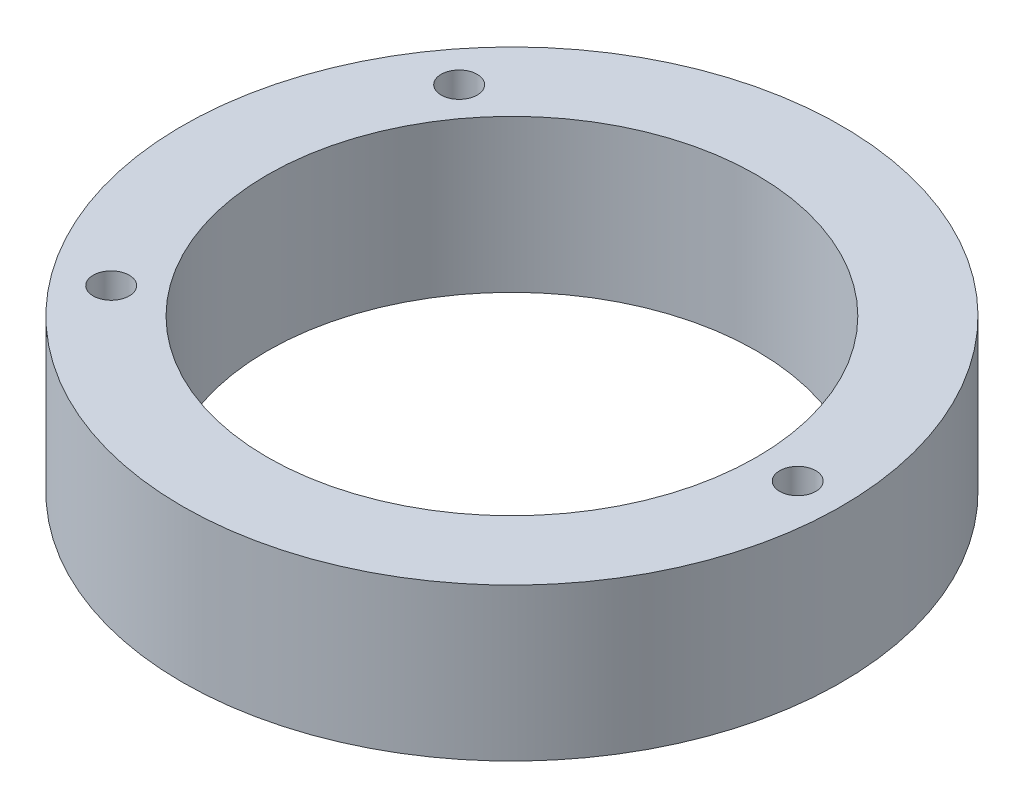
ISO-10303-21;
HEADER;
FILE_DESCRIPTION(('STEP AP214'),'2;1');
FILE_NAME('part.step','',(''),(''),'','','');
FILE_SCHEMA(('AUTOMOTIVE_DESIGN { 1 0 10303 214 1 1 1 1 }'));
ENDSEC;
DATA;
#1=APPLICATION_CONTEXT('core data for automotive mechanical design processes');
#2=APPLICATION_PROTOCOL_DEFINITION('international standard','automotive_design',2000,#1);
#3=PRODUCT_CONTEXT('',#1,'mechanical');
#4=PRODUCT('Part','Part','',(#3));
#5=PRODUCT_RELATED_PRODUCT_CATEGORY('part','',(#4));
#6=PRODUCT_DEFINITION_FORMATION('','',#4);
#7=PRODUCT_DEFINITION_CONTEXT('part definition',#1,'design');
#8=PRODUCT_DEFINITION('design','',#6,#7);
#9=PRODUCT_DEFINITION_SHAPE('','',#8);
#10=(LENGTH_UNIT() NAMED_UNIT(*) SI_UNIT(.MILLI.,.METRE.));
#11=(NAMED_UNIT(*) PLANE_ANGLE_UNIT() SI_UNIT($,.RADIAN.));
#12=(NAMED_UNIT(*) SI_UNIT($,.STERADIAN.) SOLID_ANGLE_UNIT());
#13=UNCERTAINTY_MEASURE_WITH_UNIT(LENGTH_MEASURE(1.E-05),#10,'distance_accuracy_value','');
#14=(GEOMETRIC_REPRESENTATION_CONTEXT(3) GLOBAL_UNCERTAINTY_ASSIGNED_CONTEXT((#13)) GLOBAL_UNIT_ASSIGNED_CONTEXT((#10,
#11,#12)) REPRESENTATION_CONTEXT('',''));
#15=CARTESIAN_POINT('',(0.,0.,0.));
#16=DIRECTION('',(0.,0.,1.));
#17=DIRECTION('',(1.,0.,0.));
#18=AXIS2_PLACEMENT_3D('',#15,#16,#17);
#19=CARTESIAN_POINT('',(0.,14.8,0.));
#20=DIRECTION('',(0.,1.,0.));
#21=DIRECTION('',(0.,0.,1.));
#22=AXIS2_PLACEMENT_3D('',#19,#20,#21);
#23=PLANE('',#22);
#24=CARTESIAN_POINT('',(-22.0155551930818,14.8,16.893129654992));
#25=DIRECTION('',(0.,1.,0.));
#26=DIRECTION('',(0.,0.,1.));
#27=AXIS2_PLACEMENT_3D('',#24,#25,#26);
#28=CIRCLE('',#27,1.75);
#29=CARTESIAN_POINT('',(-22.0155551930818,14.8,18.643129654992));
#30=VERTEX_POINT('',#29);
#31=EDGE_CURVE('E53',#30,#30,#28,.T.);
#32=ORIENTED_EDGE('',*,*,#31,.F.);
#33=EDGE_LOOP('',(#32));
#34=FACE_BOUND('',#33,.T.);
#35=CARTESIAN_POINT('',(0.,14.8,0.));
#36=DIRECTION('',(0.,1.,0.));
#37=DIRECTION('',(0.,0.,1.));
#38=AXIS2_PLACEMENT_3D('',#35,#36,#37);
#39=CIRCLE('',#38,23.75);
#40=CARTESIAN_POINT('',(0.,14.8,23.75));
#41=VERTEX_POINT('',#40);
#42=EDGE_CURVE('E42',#41,#41,#39,.T.);
#43=ORIENTED_EDGE('',*,*,#42,.F.);
#44=EDGE_LOOP('',(#43));
#45=FACE_BOUND('',#44,.T.);
#46=CARTESIAN_POINT('',(0.,14.8,0.));
#47=DIRECTION('',(0.,1.,0.));
#48=DIRECTION('',(0.,0.,1.));
#49=AXIS2_PLACEMENT_3D('',#46,#47,#48);
#50=CIRCLE('',#49,32.);
#51=CARTESIAN_POINT('',(0.,14.8,32.));
#52=VERTEX_POINT('',#51);
#53=EDGE_CURVE('E10',#52,#52,#50,.T.);
#54=ORIENTED_EDGE('',*,*,#53,.T.);
#55=EDGE_LOOP('',(#54));
#56=FACE_BOUND('',#55,.T.);
#57=CARTESIAN_POINT('',(27.75,14.8,0.));
#58=DIRECTION('',(0.,1.,0.));
#59=DIRECTION('',(0.,0.,1.));
#60=AXIS2_PLACEMENT_3D('',#57,#58,#59);
#61=CIRCLE('',#60,1.75);
#62=CARTESIAN_POINT('',(27.75,14.8,1.75));
#63=VERTEX_POINT('',#62);
#64=EDGE_CURVE('E47',#63,#63,#61,.T.);
#65=ORIENTED_EDGE('',*,*,#64,.F.);
#66=EDGE_LOOP('',(#65));
#67=FACE_BOUND('',#66,.T.);
#68=CARTESIAN_POINT('',(-22.0155551930818,14.8,-16.893129654992));
#69=DIRECTION('',(0.,1.,0.));
#70=DIRECTION('',(0.,0.,1.));
#71=AXIS2_PLACEMENT_3D('',#68,#69,#70);
#72=CIRCLE('',#71,1.75);
#73=CARTESIAN_POINT('',(-22.0155551930818,14.8,-15.143129654992));
#74=VERTEX_POINT('',#73);
#75=EDGE_CURVE('E59',#74,#74,#72,.T.);
#76=ORIENTED_EDGE('',*,*,#75,.F.);
#77=EDGE_LOOP('',(#76));
#78=FACE_BOUND('',#77,.T.);
#79=ADVANCED_FACE('F31',(#34,#45,#56,#67,#78),#23,.T.);
#80=CARTESIAN_POINT('',(0.,0.,0.));
#81=DIRECTION('',(0.,1.,0.));
#82=DIRECTION('',(0.,0.,1.));
#83=AXIS2_PLACEMENT_3D('',#80,#81,#82);
#84=PLANE('',#83);
#85=CARTESIAN_POINT('',(0.,0.,0.));
#86=DIRECTION('',(0.,1.,0.));
#87=DIRECTION('',(0.,0.,1.));
#88=AXIS2_PLACEMENT_3D('',#85,#86,#87);
#89=CIRCLE('',#88,32.);
#90=CARTESIAN_POINT('',(0.,0.,32.));
#91=VERTEX_POINT('',#90);
#92=EDGE_CURVE('E35',#91,#91,#89,.T.);
#93=ORIENTED_EDGE('',*,*,#92,.F.);
#94=EDGE_LOOP('',(#93));
#95=FACE_BOUND('',#94,.T.);
#96=CARTESIAN_POINT('',(0.,0.,0.));
#97=DIRECTION('',(0.,1.,0.));
#98=DIRECTION('',(0.,0.,1.));
#99=AXIS2_PLACEMENT_3D('',#96,#97,#98);
#100=CIRCLE('',#99,23.75);
#101=CARTESIAN_POINT('',(0.,0.,23.75));
#102=VERTEX_POINT('',#101);
#103=EDGE_CURVE('E44',#102,#102,#100,.T.);
#104=ORIENTED_EDGE('',*,*,#103,.T.);
#105=EDGE_LOOP('',(#104));
#106=FACE_BOUND('',#105,.T.);
#107=CARTESIAN_POINT('',(27.75,0.,0.));
#108=DIRECTION('',(0.,1.,0.));
#109=DIRECTION('',(0.,0.,1.));
#110=AXIS2_PLACEMENT_3D('',#107,#108,#109);
#111=CIRCLE('',#110,1.75);
#112=CARTESIAN_POINT('',(27.75,0.,1.75));
#113=VERTEX_POINT('',#112);
#114=EDGE_CURVE('E50',#113,#113,#111,.T.);
#115=ORIENTED_EDGE('',*,*,#114,.T.);
#116=EDGE_LOOP('',(#115));
#117=FACE_BOUND('',#116,.T.);
#118=CARTESIAN_POINT('',(-22.0155551930818,0.,16.893129654992));
#119=DIRECTION('',(0.,1.,0.));
#120=DIRECTION('',(0.,0.,1.));
#121=AXIS2_PLACEMENT_3D('',#118,#119,#120);
#122=CIRCLE('',#121,1.75);
#123=CARTESIAN_POINT('',(-22.0155551930818,0.,18.643129654992));
#124=VERTEX_POINT('',#123);
#125=EDGE_CURVE('E56',#124,#124,#122,.T.);
#126=ORIENTED_EDGE('',*,*,#125,.T.);
#127=EDGE_LOOP('',(#126));
#128=FACE_BOUND('',#127,.T.);
#129=CARTESIAN_POINT('',(-22.0155551930818,0.,-16.893129654992));
#130=DIRECTION('',(0.,1.,0.));
#131=DIRECTION('',(0.,0.,1.));
#132=AXIS2_PLACEMENT_3D('',#129,#130,#131);
#133=CIRCLE('',#132,1.75);
#134=CARTESIAN_POINT('',(-22.0155551930818,0.,-15.143129654992));
#135=VERTEX_POINT('',#134);
#136=EDGE_CURVE('E62',#135,#135,#133,.T.);
#137=ORIENTED_EDGE('',*,*,#136,.T.);
#138=EDGE_LOOP('',(#137));
#139=FACE_BOUND('',#138,.T.);
#140=ADVANCED_FACE('F72',(#95,#106,#117,#128,#139),#84,.F.);
#141=CARTESIAN_POINT('',(0.,14.8,0.));
#142=DIRECTION('',(0.,-1.,0.));
#143=DIRECTION('',(0.,0.,-1.));
#144=AXIS2_PLACEMENT_3D('',#141,#142,#143);
#145=CYLINDRICAL_SURFACE('',#144,32.);
#146=ORIENTED_EDGE('',*,*,#53,.F.);
#147=EDGE_LOOP('',(#146));
#148=FACE_BOUND('',#147,.T.);
#149=ORIENTED_EDGE('',*,*,#92,.T.);
#150=EDGE_LOOP('',(#149));
#151=FACE_BOUND('',#150,.T.);
#152=ADVANCED_FACE('F33',(#148,#151),#145,.T.);
#153=CARTESIAN_POINT('',(0.,14.8,0.));
#154=DIRECTION('',(0.,-1.,0.));
#155=DIRECTION('',(0.,0.,-1.));
#156=AXIS2_PLACEMENT_3D('',#153,#154,#155);
#157=CYLINDRICAL_SURFACE('',#156,23.75);
#158=ORIENTED_EDGE('',*,*,#42,.T.);
#159=EDGE_LOOP('',(#158));
#160=FACE_BOUND('',#159,.T.);
#161=ORIENTED_EDGE('',*,*,#103,.F.);
#162=EDGE_LOOP('',(#161));
#163=FACE_BOUND('',#162,.T.);
#164=ADVANCED_FACE('F82',(#160,#163),#157,.F.);
#165=CARTESIAN_POINT('',(27.75,14.8,0.));
#166=DIRECTION('',(0.,-1.,0.));
#167=DIRECTION('',(0.,0.,-1.));
#168=AXIS2_PLACEMENT_3D('',#165,#166,#167);
#169=CYLINDRICAL_SURFACE('',#168,1.75);
#170=ORIENTED_EDGE('',*,*,#64,.T.);
#171=EDGE_LOOP('',(#170));
#172=FACE_BOUND('',#171,.T.);
#173=ORIENTED_EDGE('',*,*,#114,.F.);
#174=EDGE_LOOP('',(#173));
#175=FACE_BOUND('',#174,.T.);
#176=ADVANCED_FACE('F85',(#172,#175),#169,.F.);
#177=CARTESIAN_POINT('',(-22.0155551930818,14.8,16.893129654992));
#178=DIRECTION('',(0.,-1.,0.));
#179=DIRECTION('',(0.,0.,-1.));
#180=AXIS2_PLACEMENT_3D('',#177,#178,#179);
#181=CYLINDRICAL_SURFACE('',#180,1.75);
#182=ORIENTED_EDGE('',*,*,#31,.T.);
#183=EDGE_LOOP('',(#182));
#184=FACE_BOUND('',#183,.T.);
#185=ORIENTED_EDGE('',*,*,#125,.F.);
#186=EDGE_LOOP('',(#185));
#187=FACE_BOUND('',#186,.T.);
#188=ADVANCED_FACE('F89',(#184,#187),#181,.F.);
#189=CARTESIAN_POINT('',(-22.0155551930818,14.8,-16.893129654992));
#190=DIRECTION('',(0.,-1.,0.));
#191=DIRECTION('',(0.,0.,-1.));
#192=AXIS2_PLACEMENT_3D('',#189,#190,#191);
#193=CYLINDRICAL_SURFACE('',#192,1.75);
#194=ORIENTED_EDGE('',*,*,#75,.T.);
#195=EDGE_LOOP('',(#194));
#196=FACE_BOUND('',#195,.T.);
#197=ORIENTED_EDGE('',*,*,#136,.F.);
#198=EDGE_LOOP('',(#197));
#199=FACE_BOUND('',#198,.T.);
#200=ADVANCED_FACE('F68',(#196,#199),#193,.F.);
#201=CLOSED_SHELL('',(#79,#140,#152,#164,#176,#188,#200));
#202=MANIFOLD_SOLID_BREP('B2',#201);
#203=ADVANCED_BREP_SHAPE_REPRESENTATION('',(#18,#202),#14);
#204=SHAPE_DEFINITION_REPRESENTATION(#9,#203);
ENDSEC;
END-ISO-10303-21;
